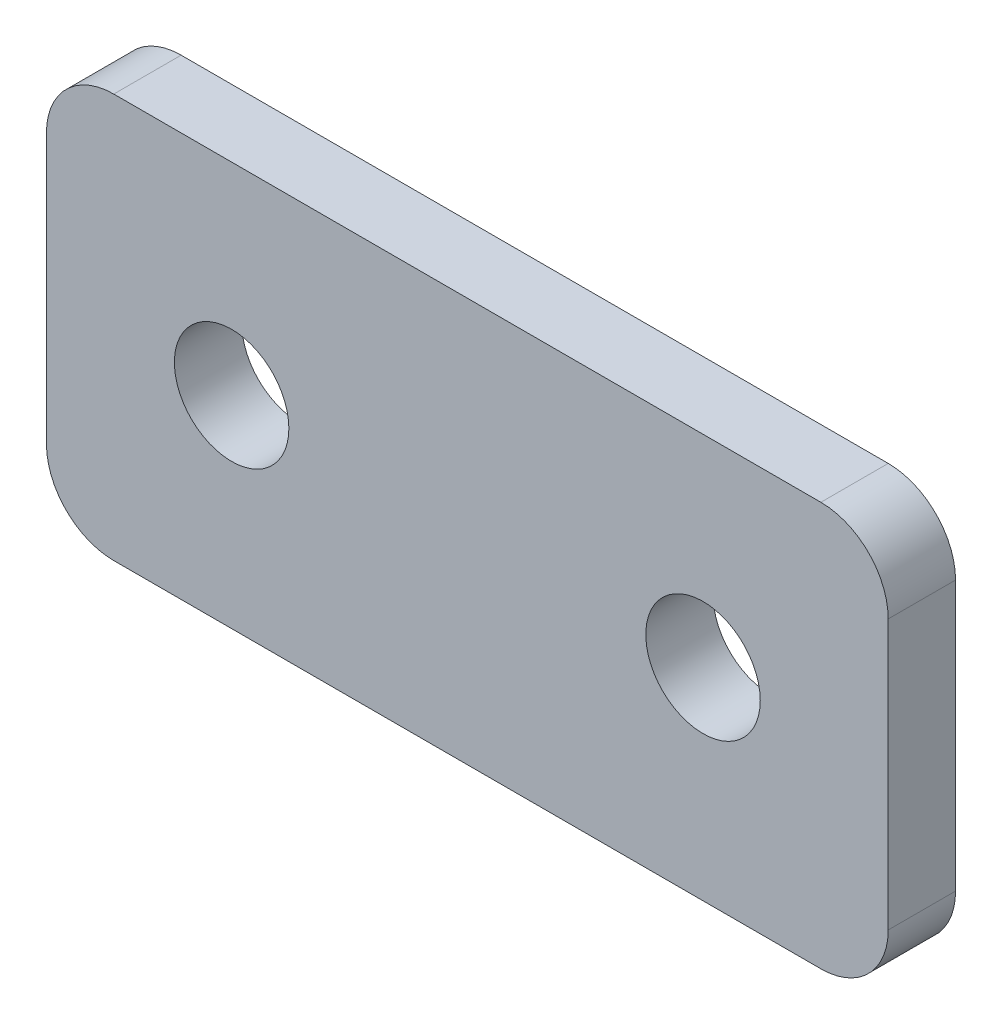
ISO-10303-21;
HEADER;
FILE_DESCRIPTION(('STEP AP214'),'2;1');
FILE_NAME('part.step','',(''),(''),'','','');
FILE_SCHEMA(('AUTOMOTIVE_DESIGN { 1 0 10303 214 1 1 1 1 }'));
ENDSEC;
DATA;
#1=APPLICATION_CONTEXT('core data for automotive mechanical design processes');
#2=APPLICATION_PROTOCOL_DEFINITION('international standard','automotive_design',2000,#1);
#3=PRODUCT_CONTEXT('',#1,'mechanical');
#4=PRODUCT('Part','Part','',(#3));
#5=PRODUCT_RELATED_PRODUCT_CATEGORY('part','',(#4));
#6=PRODUCT_DEFINITION_FORMATION('','',#4);
#7=PRODUCT_DEFINITION_CONTEXT('part definition',#1,'design');
#8=PRODUCT_DEFINITION('design','',#6,#7);
#9=PRODUCT_DEFINITION_SHAPE('','',#8);
#10=(LENGTH_UNIT() NAMED_UNIT(*) SI_UNIT(.MILLI.,.METRE.));
#11=(NAMED_UNIT(*) PLANE_ANGLE_UNIT() SI_UNIT($,.RADIAN.));
#12=(NAMED_UNIT(*) SI_UNIT($,.STERADIAN.) SOLID_ANGLE_UNIT());
#13=UNCERTAINTY_MEASURE_WITH_UNIT(LENGTH_MEASURE(1.E-05),#10,'distance_accuracy_value','');
#14=(GEOMETRIC_REPRESENTATION_CONTEXT(3) GLOBAL_UNCERTAINTY_ASSIGNED_CONTEXT((#13)) GLOBAL_UNIT_ASSIGNED_CONTEXT((#10,
#11,#12)) REPRESENTATION_CONTEXT('',''));
#15=CARTESIAN_POINT('',(0.,0.,0.));
#16=DIRECTION('',(0.,0.,1.));
#17=DIRECTION('',(1.,0.,0.));
#18=AXIS2_PLACEMENT_3D('',#15,#16,#17);
#19=CARTESIAN_POINT('',(12.5,-6.,2.));
#20=DIRECTION('',(-1.,0.,0.));
#21=DIRECTION('',(0.,0.,1.));
#22=AXIS2_PLACEMENT_3D('',#19,#20,#21);
#23=PLANE('',#22);
#24=DIRECTION('',(0.,1.,0.));
#25=VECTOR('',#24,1.);
#26=CARTESIAN_POINT('',(12.5,-6.,2.));
#27=LINE('',#26,#25);
#28=CARTESIAN_POINT('',(12.5,-4.,2.));
#29=VERTEX_POINT('',#28);
#30=CARTESIAN_POINT('',(12.5,4.,2.));
#31=VERTEX_POINT('',#30);
#32=EDGE_CURVE('E126',#29,#31,#27,.T.);
#33=ORIENTED_EDGE('',*,*,#32,.F.);
#34=DIRECTION('',(0.,0.,-1.));
#35=VECTOR('',#34,1.);
#36=CARTESIAN_POINT('',(12.5,-4.,2.));
#37=LINE('',#36,#35);
#38=CARTESIAN_POINT('',(12.5,-4.,0.));
#39=VERTEX_POINT('',#38);
#40=EDGE_CURVE('E152',#29,#39,#37,.T.);
#41=ORIENTED_EDGE('',*,*,#40,.T.);
#42=DIRECTION('',(0.,1.,0.));
#43=VECTOR('',#42,1.);
#44=CARTESIAN_POINT('',(12.5,-6.,0.));
#45=LINE('',#44,#43);
#46=CARTESIAN_POINT('',(12.5,4.,0.));
#47=VERTEX_POINT('',#46);
#48=EDGE_CURVE('E160',#39,#47,#45,.T.);
#49=ORIENTED_EDGE('',*,*,#48,.T.);
#50=DIRECTION('',(0.,0.,-1.));
#51=VECTOR('',#50,1.);
#52=CARTESIAN_POINT('',(12.5,4.,2.));
#53=LINE('',#52,#51);
#54=EDGE_CURVE('E150',#47,#31,#53,.F.);
#55=ORIENTED_EDGE('',*,*,#54,.T.);
#56=EDGE_LOOP('',(#33,#41,#49,#55));
#57=FACE_BOUND('',#56,.T.);
#58=ADVANCED_FACE('F35',(#57),#23,.F.);
#59=CARTESIAN_POINT('',(-12.5,6.,2.));
#60=DIRECTION('',(0.,-1.,0.));
#61=DIRECTION('',(0.,0.,-1.));
#62=AXIS2_PLACEMENT_3D('',#59,#60,#61);
#63=PLANE('',#62);
#64=DIRECTION('',(-1.,0.,0.));
#65=VECTOR('',#64,1.);
#66=CARTESIAN_POINT('',(-12.5,6.,0.));
#67=LINE('',#66,#65);
#68=CARTESIAN_POINT('',(10.5,6.,0.));
#69=VERTEX_POINT('',#68);
#70=CARTESIAN_POINT('',(-10.5,6.,0.));
#71=VERTEX_POINT('',#70);
#72=EDGE_CURVE('E131',#69,#71,#67,.T.);
#73=ORIENTED_EDGE('',*,*,#72,.T.);
#74=DIRECTION('',(0.,0.,-1.));
#75=VECTOR('',#74,1.);
#76=CARTESIAN_POINT('',(-10.5,6.,2.));
#77=LINE('',#76,#75);
#78=CARTESIAN_POINT('',(-10.5,6.,2.));
#79=VERTEX_POINT('',#78);
#80=EDGE_CURVE('E11',#71,#79,#77,.F.);
#81=ORIENTED_EDGE('',*,*,#80,.T.);
#82=DIRECTION('',(-1.,0.,0.));
#83=VECTOR('',#82,1.);
#84=CARTESIAN_POINT('',(-12.5,6.,2.));
#85=LINE('',#84,#83);
#86=CARTESIAN_POINT('',(10.5,6.,2.));
#87=VERTEX_POINT('',#86);
#88=EDGE_CURVE('E129',#87,#79,#85,.T.);
#89=ORIENTED_EDGE('',*,*,#88,.F.);
#90=DIRECTION('',(0.,0.,-1.));
#91=VECTOR('',#90,1.);
#92=CARTESIAN_POINT('',(10.5,6.,2.));
#93=LINE('',#92,#91);
#94=EDGE_CURVE('E43',#87,#69,#93,.T.);
#95=ORIENTED_EDGE('',*,*,#94,.T.);
#96=EDGE_LOOP('',(#73,#81,#89,#95));
#97=FACE_BOUND('',#96,.T.);
#98=ADVANCED_FACE('F157',(#97),#63,.F.);
#99=CARTESIAN_POINT('',(-12.5,-6.,2.));
#100=DIRECTION('',(1.,0.,0.));
#101=DIRECTION('',(0.,0.,-1.));
#102=AXIS2_PLACEMENT_3D('',#99,#100,#101);
#103=PLANE('',#102);
#104=DIRECTION('',(0.,-1.,0.));
#105=VECTOR('',#104,1.);
#106=CARTESIAN_POINT('',(-12.5,-6.,0.));
#107=LINE('',#106,#105);
#108=CARTESIAN_POINT('',(-12.5,4.,0.));
#109=VERTEX_POINT('',#108);
#110=CARTESIAN_POINT('',(-12.5,-4.,0.));
#111=VERTEX_POINT('',#110);
#112=EDGE_CURVE('E127',#109,#111,#107,.T.);
#113=ORIENTED_EDGE('',*,*,#112,.T.);
#114=DIRECTION('',(0.,0.,-1.));
#115=VECTOR('',#114,1.);
#116=CARTESIAN_POINT('',(-12.5,-4.,2.));
#117=LINE('',#116,#115);
#118=CARTESIAN_POINT('',(-12.5,-4.,2.));
#119=VERTEX_POINT('',#118);
#120=EDGE_CURVE('E105',#111,#119,#117,.F.);
#121=ORIENTED_EDGE('',*,*,#120,.T.);
#122=DIRECTION('',(0.,-1.,0.));
#123=VECTOR('',#122,1.);
#124=CARTESIAN_POINT('',(-12.5,-6.,2.));
#125=LINE('',#124,#123);
#126=CARTESIAN_POINT('',(-12.5,4.,2.));
#127=VERTEX_POINT('',#126);
#128=EDGE_CURVE('E165',#127,#119,#125,.T.);
#129=ORIENTED_EDGE('',*,*,#128,.F.);
#130=DIRECTION('',(0.,0.,-1.));
#131=VECTOR('',#130,1.);
#132=CARTESIAN_POINT('',(-12.5,4.,2.));
#133=LINE('',#132,#131);
#134=EDGE_CURVE('E110',#127,#109,#133,.T.);
#135=ORIENTED_EDGE('',*,*,#134,.T.);
#136=EDGE_LOOP('',(#113,#121,#129,#135));
#137=FACE_BOUND('',#136,.T.);
#138=ADVANCED_FACE('F192',(#137),#103,.F.);
#139=CARTESIAN_POINT('',(-12.5,-6.,2.));
#140=DIRECTION('',(0.,1.,0.));
#141=DIRECTION('',(0.,0.,1.));
#142=AXIS2_PLACEMENT_3D('',#139,#140,#141);
#143=PLANE('',#142);
#144=DIRECTION('',(1.,0.,0.));
#145=VECTOR('',#144,1.);
#146=CARTESIAN_POINT('',(-12.5,-6.,2.));
#147=LINE('',#146,#145);
#148=CARTESIAN_POINT('',(-10.5,-6.,2.));
#149=VERTEX_POINT('',#148);
#150=CARTESIAN_POINT('',(10.5,-6.,2.));
#151=VERTEX_POINT('',#150);
#152=EDGE_CURVE('E120',#149,#151,#147,.T.);
#153=ORIENTED_EDGE('',*,*,#152,.F.);
#154=DIRECTION('',(0.,0.,-1.));
#155=VECTOR('',#154,1.);
#156=CARTESIAN_POINT('',(-10.5,-6.,2.));
#157=LINE('',#156,#155);
#158=CARTESIAN_POINT('',(-10.5,-6.,0.));
#159=VERTEX_POINT('',#158);
#160=EDGE_CURVE('E104',#149,#159,#157,.T.);
#161=ORIENTED_EDGE('',*,*,#160,.T.);
#162=DIRECTION('',(1.,0.,0.));
#163=VECTOR('',#162,1.);
#164=CARTESIAN_POINT('',(-12.5,-6.,0.));
#165=LINE('',#164,#163);
#166=CARTESIAN_POINT('',(10.5,-6.,0.));
#167=VERTEX_POINT('',#166);
#168=EDGE_CURVE('E117',#159,#167,#165,.T.);
#169=ORIENTED_EDGE('',*,*,#168,.T.);
#170=DIRECTION('',(0.,0.,-1.));
#171=VECTOR('',#170,1.);
#172=CARTESIAN_POINT('',(10.5,-6.,2.));
#173=LINE('',#172,#171);
#174=EDGE_CURVE('E122',#167,#151,#173,.F.);
#175=ORIENTED_EDGE('',*,*,#174,.T.);
#176=EDGE_LOOP('',(#153,#161,#169,#175));
#177=FACE_BOUND('',#176,.T.);
#178=ADVANCED_FACE('F116',(#177),#143,.F.);
#179=CARTESIAN_POINT('',(0.,0.,2.));
#180=DIRECTION('',(0.,0.,-1.));
#181=DIRECTION('',(-1.,0.,0.));
#182=AXIS2_PLACEMENT_3D('',#179,#180,#181);
#183=PLANE('',#182);
#184=CARTESIAN_POINT('',(-7.,0.,2.));
#185=DIRECTION('',(0.,0.,1.));
#186=DIRECTION('',(1.,0.,0.));
#187=AXIS2_PLACEMENT_3D('',#184,#185,#186);
#188=CIRCLE('',#187,1.7);
#189=CARTESIAN_POINT('',(-5.3,0.,2.));
#190=VERTEX_POINT('',#189);
#191=EDGE_CURVE('E177',#190,#190,#188,.T.);
#192=ORIENTED_EDGE('',*,*,#191,.F.);
#193=EDGE_LOOP('',(#192));
#194=FACE_BOUND('',#193,.T.);
#195=CARTESIAN_POINT('',(7.,0.,2.));
#196=DIRECTION('',(0.,0.,1.));
#197=DIRECTION('',(1.,0.,0.));
#198=AXIS2_PLACEMENT_3D('',#195,#196,#197);
#199=CIRCLE('',#198,1.7);
#200=CARTESIAN_POINT('',(8.7,0.,2.));
#201=VERTEX_POINT('',#200);
#202=EDGE_CURVE('E171',#201,#201,#199,.T.);
#203=ORIENTED_EDGE('',*,*,#202,.F.);
#204=EDGE_LOOP('',(#203));
#205=FACE_BOUND('',#204,.T.);
#206=ORIENTED_EDGE('',*,*,#128,.T.);
#207=CARTESIAN_POINT('',(-10.5,-4.,2.));
#208=DIRECTION('',(0.,0.,-1.));
#209=DIRECTION('',(-1.,0.,0.));
#210=AXIS2_PLACEMENT_3D('',#207,#208,#209);
#211=CIRCLE('',#210,2.);
#212=EDGE_CURVE('E148',#119,#149,#211,.F.);
#213=ORIENTED_EDGE('',*,*,#212,.T.);
#214=ORIENTED_EDGE('',*,*,#152,.T.);
#215=CARTESIAN_POINT('',(10.5,-4.,2.));
#216=DIRECTION('',(0.,0.,-1.));
#217=DIRECTION('',(-1.,0.,0.));
#218=AXIS2_PLACEMENT_3D('',#215,#216,#217);
#219=CIRCLE('',#218,2.);
#220=EDGE_CURVE('E146',#151,#29,#219,.F.);
#221=ORIENTED_EDGE('',*,*,#220,.T.);
#222=ORIENTED_EDGE('',*,*,#32,.T.);
#223=CARTESIAN_POINT('',(10.5,4.,2.));
#224=DIRECTION('',(0.,0.,-1.));
#225=DIRECTION('',(-1.,0.,0.));
#226=AXIS2_PLACEMENT_3D('',#223,#224,#225);
#227=CIRCLE('',#226,2.);
#228=EDGE_CURVE('E55',#31,#87,#227,.F.);
#229=ORIENTED_EDGE('',*,*,#228,.T.);
#230=ORIENTED_EDGE('',*,*,#88,.T.);
#231=CARTESIAN_POINT('',(-10.5,4.,2.));
#232=DIRECTION('',(0.,0.,-1.));
#233=DIRECTION('',(-1.,0.,0.));
#234=AXIS2_PLACEMENT_3D('',#231,#232,#233);
#235=CIRCLE('',#234,2.);
#236=EDGE_CURVE('E144',#79,#127,#235,.F.);
#237=ORIENTED_EDGE('',*,*,#236,.T.);
#238=EDGE_LOOP('',(#206,#213,#214,#221,#222,#229,#230,#237));
#239=FACE_BOUND('',#238,.T.);
#240=ADVANCED_FACE('F183',(#194,#205,#239),#183,.F.);
#241=CARTESIAN_POINT('',(0.,0.,0.));
#242=DIRECTION('',(0.,0.,-1.));
#243=DIRECTION('',(-1.,0.,0.));
#244=AXIS2_PLACEMENT_3D('',#241,#242,#243);
#245=PLANE('',#244);
#246=CARTESIAN_POINT('',(-7.,0.,0.));
#247=DIRECTION('',(0.,0.,1.));
#248=DIRECTION('',(1.,0.,0.));
#249=AXIS2_PLACEMENT_3D('',#246,#247,#248);
#250=CIRCLE('',#249,1.7);
#251=CARTESIAN_POINT('',(-5.3,0.,0.));
#252=VERTEX_POINT('',#251);
#253=EDGE_CURVE('E174',#252,#252,#250,.T.);
#254=ORIENTED_EDGE('',*,*,#253,.T.);
#255=EDGE_LOOP('',(#254));
#256=FACE_BOUND('',#255,.T.);
#257=CARTESIAN_POINT('',(7.,0.,0.));
#258=DIRECTION('',(0.,0.,1.));
#259=DIRECTION('',(1.,0.,0.));
#260=AXIS2_PLACEMENT_3D('',#257,#258,#259);
#261=CIRCLE('',#260,1.7);
#262=CARTESIAN_POINT('',(8.7,0.,0.));
#263=VERTEX_POINT('',#262);
#264=EDGE_CURVE('E161',#263,#263,#261,.T.);
#265=ORIENTED_EDGE('',*,*,#264,.T.);
#266=EDGE_LOOP('',(#265));
#267=FACE_BOUND('',#266,.T.);
#268=ORIENTED_EDGE('',*,*,#168,.F.);
#269=CARTESIAN_POINT('',(-10.5,-4.,0.));
#270=DIRECTION('',(0.,0.,-1.));
#271=DIRECTION('',(-1.,0.,0.));
#272=AXIS2_PLACEMENT_3D('',#269,#270,#271);
#273=CIRCLE('',#272,2.);
#274=EDGE_CURVE('E100',#159,#111,#273,.T.);
#275=ORIENTED_EDGE('',*,*,#274,.T.);
#276=ORIENTED_EDGE('',*,*,#112,.F.);
#277=CARTESIAN_POINT('',(-10.5,4.,0.));
#278=DIRECTION('',(0.,0.,-1.));
#279=DIRECTION('',(-1.,0.,0.));
#280=AXIS2_PLACEMENT_3D('',#277,#278,#279);
#281=CIRCLE('',#280,2.);
#282=EDGE_CURVE('E137',#109,#71,#281,.T.);
#283=ORIENTED_EDGE('',*,*,#282,.T.);
#284=ORIENTED_EDGE('',*,*,#72,.F.);
#285=CARTESIAN_POINT('',(10.5,4.,0.));
#286=DIRECTION('',(0.,0.,-1.));
#287=DIRECTION('',(-1.,0.,0.));
#288=AXIS2_PLACEMENT_3D('',#285,#286,#287);
#289=CIRCLE('',#288,2.);
#290=EDGE_CURVE('E121',#69,#47,#289,.T.);
#291=ORIENTED_EDGE('',*,*,#290,.T.);
#292=ORIENTED_EDGE('',*,*,#48,.F.);
#293=CARTESIAN_POINT('',(10.5,-4.,0.));
#294=DIRECTION('',(0.,0.,-1.));
#295=DIRECTION('',(-1.,0.,0.));
#296=AXIS2_PLACEMENT_3D('',#293,#294,#295);
#297=CIRCLE('',#296,2.);
#298=EDGE_CURVE('E111',#39,#167,#297,.T.);
#299=ORIENTED_EDGE('',*,*,#298,.T.);
#300=EDGE_LOOP('',(#268,#275,#276,#283,#284,#291,#292,#299));
#301=FACE_BOUND('',#300,.T.);
#302=ADVANCED_FACE('F124',(#256,#267,#301),#245,.T.);
#303=CARTESIAN_POINT('',(7.,0.,2.));
#304=DIRECTION('',(0.,0.,1.));
#305=DIRECTION('',(1.,0.,0.));
#306=AXIS2_PLACEMENT_3D('',#303,#304,#305);
#307=CYLINDRICAL_SURFACE('',#306,1.7);
#308=ORIENTED_EDGE('',*,*,#264,.F.);
#309=EDGE_LOOP('',(#308));
#310=FACE_BOUND('',#309,.T.);
#311=ORIENTED_EDGE('',*,*,#202,.T.);
#312=EDGE_LOOP('',(#311));
#313=FACE_BOUND('',#312,.T.);
#314=ADVANCED_FACE('F217',(#310,#313),#307,.F.);
#315=CARTESIAN_POINT('',(-7.,0.,2.));
#316=DIRECTION('',(0.,0.,1.));
#317=DIRECTION('',(1.,0.,0.));
#318=AXIS2_PLACEMENT_3D('',#315,#316,#317);
#319=CYLINDRICAL_SURFACE('',#318,1.7);
#320=ORIENTED_EDGE('',*,*,#253,.F.);
#321=EDGE_LOOP('',(#320));
#322=FACE_BOUND('',#321,.T.);
#323=ORIENTED_EDGE('',*,*,#191,.T.);
#324=EDGE_LOOP('',(#323));
#325=FACE_BOUND('',#324,.T.);
#326=ADVANCED_FACE('F181',(#322,#325),#319,.F.);
#327=CARTESIAN_POINT('',(-10.5,-4.,2.));
#328=DIRECTION('',(0.,0.,-1.));
#329=DIRECTION('',(-1.,0.,0.));
#330=AXIS2_PLACEMENT_3D('',#327,#328,#329);
#331=CYLINDRICAL_SURFACE('',#330,2.);
#332=ORIENTED_EDGE('',*,*,#212,.F.);
#333=ORIENTED_EDGE('',*,*,#120,.F.);
#334=ORIENTED_EDGE('',*,*,#274,.F.);
#335=ORIENTED_EDGE('',*,*,#160,.F.);
#336=EDGE_LOOP('',(#332,#333,#334,#335));
#337=FACE_BOUND('',#336,.T.);
#338=ADVANCED_FACE('F103',(#337),#331,.T.);
#339=CARTESIAN_POINT('',(10.5,-4.,2.));
#340=DIRECTION('',(0.,0.,-1.));
#341=DIRECTION('',(-1.,0.,0.));
#342=AXIS2_PLACEMENT_3D('',#339,#340,#341);
#343=CYLINDRICAL_SURFACE('',#342,2.);
#344=ORIENTED_EDGE('',*,*,#220,.F.);
#345=ORIENTED_EDGE('',*,*,#174,.F.);
#346=ORIENTED_EDGE('',*,*,#298,.F.);
#347=ORIENTED_EDGE('',*,*,#40,.F.);
#348=EDGE_LOOP('',(#344,#345,#346,#347));
#349=FACE_BOUND('',#348,.T.);
#350=ADVANCED_FACE('F196',(#349),#343,.T.);
#351=CARTESIAN_POINT('',(-10.5,4.,2.));
#352=DIRECTION('',(0.,0.,-1.));
#353=DIRECTION('',(-1.,0.,0.));
#354=AXIS2_PLACEMENT_3D('',#351,#352,#353);
#355=CYLINDRICAL_SURFACE('',#354,2.);
#356=ORIENTED_EDGE('',*,*,#236,.F.);
#357=ORIENTED_EDGE('',*,*,#80,.F.);
#358=ORIENTED_EDGE('',*,*,#282,.F.);
#359=ORIENTED_EDGE('',*,*,#134,.F.);
#360=EDGE_LOOP('',(#356,#357,#358,#359));
#361=FACE_BOUND('',#360,.T.);
#362=ADVANCED_FACE('F194',(#361),#355,.T.);
#363=CARTESIAN_POINT('',(10.5,4.,2.));
#364=DIRECTION('',(0.,0.,-1.));
#365=DIRECTION('',(-1.,0.,0.));
#366=AXIS2_PLACEMENT_3D('',#363,#364,#365);
#367=CYLINDRICAL_SURFACE('',#366,2.);
#368=ORIENTED_EDGE('',*,*,#228,.F.);
#369=ORIENTED_EDGE('',*,*,#54,.F.);
#370=ORIENTED_EDGE('',*,*,#290,.F.);
#371=ORIENTED_EDGE('',*,*,#94,.F.);
#372=EDGE_LOOP('',(#368,#369,#370,#371));
#373=FACE_BOUND('',#372,.T.);
#374=ADVANCED_FACE('F37',(#373),#367,.T.);
#375=CLOSED_SHELL('',(#58,#98,#138,#178,#240,#302,#314,#326,#338,#350,#362,#374));
#376=MANIFOLD_SOLID_BREP('B2',#375);
#377=ADVANCED_BREP_SHAPE_REPRESENTATION('',(#18,#376),#14);
#378=SHAPE_DEFINITION_REPRESENTATION(#9,#377);
ENDSEC;
END-ISO-10303-21;
